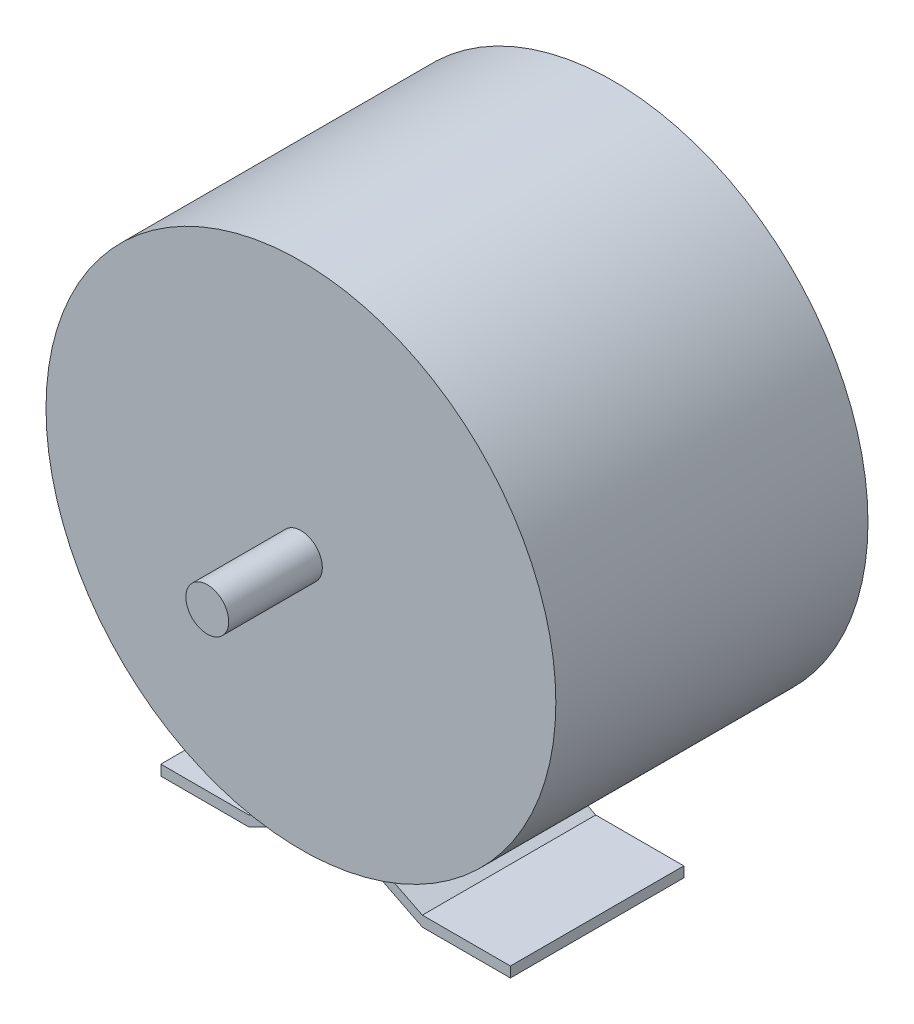
ISO-10303-21;
HEADER;
FILE_DESCRIPTION(('STEP AP214'),'2;1');
FILE_NAME('part.step','',(''),(''),'','','');
FILE_SCHEMA(('AUTOMOTIVE_DESIGN { 1 0 10303 214 1 1 1 1 }'));
ENDSEC;
DATA;
#1=APPLICATION_CONTEXT('core data for automotive mechanical design processes');
#2=APPLICATION_PROTOCOL_DEFINITION('international standard','automotive_design',2000,#1);
#3=PRODUCT_CONTEXT('',#1,'mechanical');
#4=PRODUCT('Part','Part','',(#3));
#5=PRODUCT_RELATED_PRODUCT_CATEGORY('part','',(#4));
#6=PRODUCT_DEFINITION_FORMATION('','',#4);
#7=PRODUCT_DEFINITION_CONTEXT('part definition',#1,'design');
#8=PRODUCT_DEFINITION('design','',#6,#7);
#9=PRODUCT_DEFINITION_SHAPE('','',#8);
#10=(LENGTH_UNIT() NAMED_UNIT(*) SI_UNIT(.MILLI.,.METRE.));
#11=(NAMED_UNIT(*) PLANE_ANGLE_UNIT() SI_UNIT($,.RADIAN.));
#12=(NAMED_UNIT(*) SI_UNIT($,.STERADIAN.) SOLID_ANGLE_UNIT());
#13=UNCERTAINTY_MEASURE_WITH_UNIT(LENGTH_MEASURE(1.E-05),#10,'distance_accuracy_value','');
#14=(GEOMETRIC_REPRESENTATION_CONTEXT(3) GLOBAL_UNCERTAINTY_ASSIGNED_CONTEXT((#13)) GLOBAL_UNIT_ASSIGNED_CONTEXT((#10,
#11,#12)) REPRESENTATION_CONTEXT('',''));
#15=CARTESIAN_POINT('',(0.,0.,0.));
#16=DIRECTION('',(0.,0.,1.));
#17=DIRECTION('',(1.,0.,0.));
#18=AXIS2_PLACEMENT_3D('',#15,#16,#17);
#19=CARTESIAN_POINT('',(0.,0.,90.));
#20=DIRECTION('',(0.,0.,-1.));
#21=DIRECTION('',(-1.,0.,0.));
#22=AXIS2_PLACEMENT_3D('',#19,#20,#21);
#23=CYLINDRICAL_SURFACE('',#22,73.5);
#24=CARTESIAN_POINT('',(0.,0.,90.));
#25=DIRECTION('',(0.,0.,1.));
#26=DIRECTION('',(1.,0.,0.));
#27=AXIS2_PLACEMENT_3D('',#24,#25,#26);
#28=CIRCLE('',#27,73.5);
#29=CARTESIAN_POINT('',(73.5,0.,90.));
#30=VERTEX_POINT('',#29);
#31=EDGE_CURVE('E272',#30,#30,#28,.T.);
#32=ORIENTED_EDGE('',*,*,#31,.F.);
#33=EDGE_LOOP('',(#32));
#34=FACE_BOUND('',#33,.T.);
#35=CARTESIAN_POINT('',(0.,0.,0.));
#36=DIRECTION('',(0.,0.,1.));
#37=DIRECTION('',(1.,0.,0.));
#38=AXIS2_PLACEMENT_3D('',#35,#36,#37);
#39=CIRCLE('',#38,73.5);
#40=CARTESIAN_POINT('',(73.5,0.,0.));
#41=VERTEX_POINT('',#40);
#42=EDGE_CURVE('E268',#41,#41,#39,.T.);
#43=ORIENTED_EDGE('',*,*,#42,.T.);
#44=EDGE_LOOP('',(#43));
#45=FACE_BOUND('',#44,.T.);
#46=DIRECTION('',(0.,0.,-1.));
#47=VECTOR('',#46,1.);
#48=CARTESIAN_POINT('',(6.73139788290122,-73.1911079472232,90.));
#49=LINE('',#48,#47);
#50=CARTESIAN_POINT('',(6.73139788290121,-73.1911079472232,30.));
#51=VERTEX_POINT('',#50);
#52=CARTESIAN_POINT('',(6.73139788290121,-73.1911079472232,80.));
#53=VERTEX_POINT('',#52);
#54=EDGE_CURVE('E286',#51,#53,#49,.F.);
#55=ORIENTED_EDGE('',*,*,#54,.F.);
#56=CARTESIAN_POINT('',(0.,0.,30.));
#57=DIRECTION('',(0.,0.,1.));
#58=DIRECTION('',(1.,0.,0.));
#59=AXIS2_PLACEMENT_3D('',#56,#57,#58);
#60=CIRCLE('',#59,73.5);
#61=CARTESIAN_POINT('',(-6.73139788290121,-73.1911079472232,30.));
#62=VERTEX_POINT('',#61);
#63=EDGE_CURVE('E283',#62,#51,#60,.T.);
#64=ORIENTED_EDGE('',*,*,#63,.F.);
#65=DIRECTION('',(0.,0.,-1.));
#66=VECTOR('',#65,1.);
#67=CARTESIAN_POINT('',(-6.73139788290122,-73.1911079472232,90.));
#68=LINE('',#67,#66);
#69=CARTESIAN_POINT('',(-6.73139788290121,-73.1911079472232,80.));
#70=VERTEX_POINT('',#69);
#71=EDGE_CURVE('E63',#62,#70,#68,.F.);
#72=ORIENTED_EDGE('',*,*,#71,.T.);
#73=CARTESIAN_POINT('',(0.,0.,80.));
#74=DIRECTION('',(0.,0.,1.));
#75=DIRECTION('',(1.,0.,0.));
#76=AXIS2_PLACEMENT_3D('',#73,#74,#75);
#77=CIRCLE('',#76,73.5);
#78=EDGE_CURVE('E71',#70,#53,#77,.T.);
#79=ORIENTED_EDGE('',*,*,#78,.T.);
#80=EDGE_LOOP('',(#55,#64,#72,#79));
#81=FACE_BOUND('',#80,.T.);
#82=ADVANCED_FACE('F46',(#34,#45,#81),#23,.T.);
#83=CARTESIAN_POINT('',(0.,0.,90.));
#84=DIRECTION('',(0.,0.,1.));
#85=DIRECTION('',(1.,0.,0.));
#86=AXIS2_PLACEMENT_3D('',#83,#84,#85);
#87=PLANE('',#86);
#88=CARTESIAN_POINT('',(0.,0.,90.));
#89=DIRECTION('',(0.,0.,1.));
#90=DIRECTION('',(1.,0.,0.));
#91=AXIS2_PLACEMENT_3D('',#88,#89,#90);
#92=CIRCLE('',#91,6.175);
#93=CARTESIAN_POINT('',(6.175,0.,90.));
#94=VERTEX_POINT('',#93);
#95=EDGE_CURVE('E251',#94,#94,#92,.T.);
#96=ORIENTED_EDGE('',*,*,#95,.F.);
#97=EDGE_LOOP('',(#96));
#98=FACE_BOUND('',#97,.T.);
#99=ORIENTED_EDGE('',*,*,#31,.T.);
#100=EDGE_LOOP('',(#99));
#101=FACE_BOUND('',#100,.T.);
#102=ADVANCED_FACE('F310',(#98,#101),#87,.T.);
#103=CARTESIAN_POINT('',(0.,0.,0.));
#104=DIRECTION('',(0.,0.,1.));
#105=DIRECTION('',(1.,0.,0.));
#106=AXIS2_PLACEMENT_3D('',#103,#104,#105);
#107=PLANE('',#106);
#108=ORIENTED_EDGE('',*,*,#42,.F.);
#109=EDGE_LOOP('',(#108));
#110=FACE_BOUND('',#109,.T.);
#111=ADVANCED_FACE('F312',(#110),#107,.F.);
#112=CARTESIAN_POINT('',(0.,0.,117.));
#113=DIRECTION('',(0.,0.,-1.));
#114=DIRECTION('',(-1.,0.,0.));
#115=AXIS2_PLACEMENT_3D('',#112,#113,#114);
#116=CYLINDRICAL_SURFACE('',#115,6.175);
#117=CARTESIAN_POINT('',(0.,0.,117.));
#118=DIRECTION('',(0.,0.,1.));
#119=DIRECTION('',(1.,0.,0.));
#120=AXIS2_PLACEMENT_3D('',#117,#118,#119);
#121=CIRCLE('',#120,6.175);
#122=CARTESIAN_POINT('',(6.175,0.,117.));
#123=VERTEX_POINT('',#122);
#124=EDGE_CURVE('E264',#123,#123,#121,.T.);
#125=ORIENTED_EDGE('',*,*,#124,.F.);
#126=EDGE_LOOP('',(#125));
#127=FACE_BOUND('',#126,.T.);
#128=ORIENTED_EDGE('',*,*,#95,.T.);
#129=EDGE_LOOP('',(#128));
#130=FACE_BOUND('',#129,.T.);
#131=ADVANCED_FACE('F315',(#127,#130),#116,.T.);
#132=CARTESIAN_POINT('',(0.,0.,117.));
#133=DIRECTION('',(0.,0.,1.));
#134=DIRECTION('',(1.,0.,0.));
#135=AXIS2_PLACEMENT_3D('',#132,#133,#134);
#136=PLANE('',#135);
#137=ORIENTED_EDGE('',*,*,#124,.T.);
#138=EDGE_LOOP('',(#137));
#139=FACE_BOUND('',#138,.T.);
#140=ADVANCED_FACE('F322',(#139),#136,.T.);
#141=CARTESIAN_POINT('',(-6.35,-73.,30.));
#142=DIRECTION('',(-0.447980438771671,0.894043358276287,0.));
#143=DIRECTION('',(-0.894043358276287,-0.447980438771671,0.));
#144=AXIS2_PLACEMENT_3D('',#141,#142,#143);
#145=PLANE('',#144);
#146=ORIENTED_EDGE('',*,*,#71,.F.);
#147=DIRECTION('',(-0.894043358276287,-0.447980438771671,0.));
#148=VECTOR('',#147,1.);
#149=CARTESIAN_POINT('',(-6.35,-73.,30.));
#150=LINE('',#149,#148);
#151=CARTESIAN_POINT('',(-25.,-82.3449999999997,30.));
#152=VERTEX_POINT('',#151);
#153=EDGE_CURVE('E220',#62,#152,#150,.T.);
#154=ORIENTED_EDGE('',*,*,#153,.T.);
#155=DIRECTION('',(0.,0.,1.));
#156=VECTOR('',#155,1.);
#157=CARTESIAN_POINT('',(-25.,-82.3449999999997,30.));
#158=LINE('',#157,#156);
#159=CARTESIAN_POINT('',(-25.,-82.3449999999997,80.));
#160=VERTEX_POINT('',#159);
#161=EDGE_CURVE('E252',#152,#160,#158,.T.);
#162=ORIENTED_EDGE('',*,*,#161,.T.);
#163=DIRECTION('',(-0.894043358276287,-0.447980438771671,0.));
#164=VECTOR('',#163,1.);
#165=CARTESIAN_POINT('',(-6.35,-73.,80.));
#166=LINE('',#165,#164);
#167=EDGE_CURVE('E242',#70,#160,#166,.T.);
#168=ORIENTED_EDGE('',*,*,#167,.F.);
#169=EDGE_LOOP('',(#146,#154,#162,#168));
#170=FACE_BOUND('',#169,.T.);
#171=ADVANCED_FACE('F326',(#170),#145,.T.);
#172=CARTESIAN_POINT('',(-50.4,-82.3449999999997,30.));
#173=DIRECTION('',(-1.,0.,0.));
#174=DIRECTION('',(0.,0.,1.));
#175=AXIS2_PLACEMENT_3D('',#172,#173,#174);
#176=PLANE('',#175);
#177=DIRECTION('',(0.,-1.,0.));
#178=VECTOR('',#177,1.);
#179=CARTESIAN_POINT('',(-50.4,-82.3449999999997,80.));
#180=LINE('',#179,#178);
#181=CARTESIAN_POINT('',(-50.4,-82.3449999999997,80.));
#182=VERTEX_POINT('',#181);
#183=CARTESIAN_POINT('',(-50.4,-85.345,80.));
#184=VERTEX_POINT('',#183);
#185=EDGE_CURVE('E193',#182,#184,#180,.T.);
#186=ORIENTED_EDGE('',*,*,#185,.F.);
#187=DIRECTION('',(0.,0.,1.));
#188=VECTOR('',#187,1.);
#189=CARTESIAN_POINT('',(-50.4,-82.3449999999997,30.));
#190=LINE('',#189,#188);
#191=CARTESIAN_POINT('',(-50.4,-82.3449999999997,30.));
#192=VERTEX_POINT('',#191);
#193=EDGE_CURVE('E248',#192,#182,#190,.T.);
#194=ORIENTED_EDGE('',*,*,#193,.F.);
#195=DIRECTION('',(0.,-1.,0.));
#196=VECTOR('',#195,1.);
#197=CARTESIAN_POINT('',(-50.4,-82.3449999999997,30.));
#198=LINE('',#197,#196);
#199=CARTESIAN_POINT('',(-50.4,-85.345,30.));
#200=VERTEX_POINT('',#199);
#201=EDGE_CURVE('E204',#192,#200,#198,.T.);
#202=ORIENTED_EDGE('',*,*,#201,.T.);
#203=DIRECTION('',(0.,0.,1.));
#204=VECTOR('',#203,1.);
#205=CARTESIAN_POINT('',(-50.4,-85.345,30.));
#206=LINE('',#205,#204);
#207=EDGE_CURVE('E227',#200,#184,#206,.T.);
#208=ORIENTED_EDGE('',*,*,#207,.T.);
#209=EDGE_LOOP('',(#186,#194,#202,#208));
#210=FACE_BOUND('',#209,.T.);
#211=ADVANCED_FACE('F328',(#210),#176,.T.);
#212=CARTESIAN_POINT('',(-25.,-82.3449999999997,30.));
#213=DIRECTION('',(0.,1.,0.));
#214=DIRECTION('',(-1.,0.,0.));
#215=AXIS2_PLACEMENT_3D('',#212,#213,#214);
#216=PLANE('',#215);
#217=DIRECTION('',(-1.,0.,0.));
#218=VECTOR('',#217,1.);
#219=CARTESIAN_POINT('',(-25.,-82.3449999999997,80.));
#220=LINE('',#219,#218);
#221=EDGE_CURVE('E209',#160,#182,#220,.T.);
#222=ORIENTED_EDGE('',*,*,#221,.F.);
#223=ORIENTED_EDGE('',*,*,#161,.F.);
#224=DIRECTION('',(-1.,0.,0.));
#225=VECTOR('',#224,1.);
#226=CARTESIAN_POINT('',(-25.,-82.3449999999997,30.));
#227=LINE('',#226,#225);
#228=EDGE_CURVE('E223',#152,#192,#227,.T.);
#229=ORIENTED_EDGE('',*,*,#228,.T.);
#230=ORIENTED_EDGE('',*,*,#193,.T.);
#231=EDGE_LOOP('',(#222,#223,#229,#230));
#232=FACE_BOUND('',#231,.T.);
#233=ADVANCED_FACE('F331',(#232),#216,.T.);
#234=CARTESIAN_POINT('',(-6.35,-76.0000000000002,30.));
#235=DIRECTION('',(0.,-1.,0.));
#236=DIRECTION('',(0.,0.,-1.));
#237=AXIS2_PLACEMENT_3D('',#234,#235,#236);
#238=PLANE('',#237);
#239=DIRECTION('',(1.,0.,0.));
#240=VECTOR('',#239,1.);
#241=CARTESIAN_POINT('',(-6.35,-76.0000000000002,80.));
#242=LINE('',#241,#240);
#243=CARTESIAN_POINT('',(-6.35,-76.0000000000002,80.));
#244=VERTEX_POINT('',#243);
#245=CARTESIAN_POINT('',(6.35,-76.0000000000002,80.));
#246=VERTEX_POINT('',#245);
#247=EDGE_CURVE('E239',#244,#246,#242,.T.);
#248=ORIENTED_EDGE('',*,*,#247,.F.);
#249=DIRECTION('',(0.,0.,1.));
#250=VECTOR('',#249,1.);
#251=CARTESIAN_POINT('',(-6.35,-76.0000000000002,30.));
#252=LINE('',#251,#250);
#253=CARTESIAN_POINT('',(-6.35,-76.0000000000002,30.));
#254=VERTEX_POINT('',#253);
#255=EDGE_CURVE('E256',#254,#244,#252,.T.);
#256=ORIENTED_EDGE('',*,*,#255,.F.);
#257=DIRECTION('',(1.,0.,0.));
#258=VECTOR('',#257,1.);
#259=CARTESIAN_POINT('',(-6.35,-76.0000000000002,30.));
#260=LINE('',#259,#258);
#261=CARTESIAN_POINT('',(6.35,-76.0000000000002,30.));
#262=VERTEX_POINT('',#261);
#263=EDGE_CURVE('E217',#254,#262,#260,.T.);
#264=ORIENTED_EDGE('',*,*,#263,.T.);
#265=DIRECTION('',(0.,0.,1.));
#266=VECTOR('',#265,1.);
#267=CARTESIAN_POINT('',(6.35,-76.0000000000002,30.));
#268=LINE('',#267,#266);
#269=EDGE_CURVE('E198',#262,#246,#268,.T.);
#270=ORIENTED_EDGE('',*,*,#269,.T.);
#271=EDGE_LOOP('',(#248,#256,#264,#270));
#272=FACE_BOUND('',#271,.T.);
#273=ADVANCED_FACE('F340',(#272),#238,.T.);
#274=CARTESIAN_POINT('',(-25.,-85.345,30.));
#275=DIRECTION('',(0.447980438771671,-0.894043358276287,0.));
#276=DIRECTION('',(0.894043358276287,0.447980438771671,0.));
#277=AXIS2_PLACEMENT_3D('',#274,#275,#276);
#278=PLANE('',#277);
#279=DIRECTION('',(0.894043358276287,0.447980438771671,0.));
#280=VECTOR('',#279,1.);
#281=CARTESIAN_POINT('',(-25.,-85.345,80.));
#282=LINE('',#281,#280);
#283=CARTESIAN_POINT('',(-25.,-85.345,80.));
#284=VERTEX_POINT('',#283);
#285=EDGE_CURVE('E235',#284,#244,#282,.T.);
#286=ORIENTED_EDGE('',*,*,#285,.F.);
#287=DIRECTION('',(0.,0.,1.));
#288=VECTOR('',#287,1.);
#289=CARTESIAN_POINT('',(-25.,-85.345,30.));
#290=LINE('',#289,#288);
#291=CARTESIAN_POINT('',(-25.,-85.345,30.));
#292=VERTEX_POINT('',#291);
#293=EDGE_CURVE('E259',#292,#284,#290,.T.);
#294=ORIENTED_EDGE('',*,*,#293,.F.);
#295=DIRECTION('',(0.894043358276287,0.447980438771671,0.));
#296=VECTOR('',#295,1.);
#297=CARTESIAN_POINT('',(-25.,-85.345,30.));
#298=LINE('',#297,#296);
#299=EDGE_CURVE('E213',#292,#254,#298,.T.);
#300=ORIENTED_EDGE('',*,*,#299,.T.);
#301=ORIENTED_EDGE('',*,*,#255,.T.);
#302=EDGE_LOOP('',(#286,#294,#300,#301));
#303=FACE_BOUND('',#302,.T.);
#304=ADVANCED_FACE('F336',(#303),#278,.T.);
#305=CARTESIAN_POINT('',(-50.4,-85.345,30.));
#306=DIRECTION('',(0.,-1.,0.));
#307=DIRECTION('',(1.,0.,0.));
#308=AXIS2_PLACEMENT_3D('',#305,#306,#307);
#309=PLANE('',#308);
#310=DIRECTION('',(1.,0.,0.));
#311=VECTOR('',#310,1.);
#312=CARTESIAN_POINT('',(-50.4,-85.345,80.));
#313=LINE('',#312,#311);
#314=EDGE_CURVE('E231',#184,#284,#313,.T.);
#315=ORIENTED_EDGE('',*,*,#314,.F.);
#316=ORIENTED_EDGE('',*,*,#207,.F.);
#317=DIRECTION('',(1.,0.,0.));
#318=VECTOR('',#317,1.);
#319=CARTESIAN_POINT('',(-50.4,-85.345,30.));
#320=LINE('',#319,#318);
#321=EDGE_CURVE('E208',#200,#292,#320,.T.);
#322=ORIENTED_EDGE('',*,*,#321,.T.);
#323=ORIENTED_EDGE('',*,*,#293,.T.);
#324=EDGE_LOOP('',(#315,#316,#322,#323));
#325=FACE_BOUND('',#324,.T.);
#326=ADVANCED_FACE('F333',(#325),#309,.T.);
#327=CARTESIAN_POINT('',(0.,0.,30.));
#328=DIRECTION('',(0.,0.,1.));
#329=DIRECTION('',(1.,0.,0.));
#330=AXIS2_PLACEMENT_3D('',#327,#328,#329);
#331=PLANE('',#330);
#332=ORIENTED_EDGE('',*,*,#153,.F.);
#333=ORIENTED_EDGE('',*,*,#63,.T.);
#334=DIRECTION('',(0.894043358276287,-0.447980438771671,0.));
#335=VECTOR('',#334,1.);
#336=CARTESIAN_POINT('',(6.35,-73.,30.));
#337=LINE('',#336,#335);
#338=CARTESIAN_POINT('',(25.,-82.3449999999997,30.));
#339=VERTEX_POINT('',#338);
#340=EDGE_CURVE('E144',#51,#339,#337,.T.);
#341=ORIENTED_EDGE('',*,*,#340,.T.);
#342=DIRECTION('',(1.,0.,0.));
#343=VECTOR('',#342,1.);
#344=CARTESIAN_POINT('',(25.,-82.3449999999997,30.));
#345=LINE('',#344,#343);
#346=CARTESIAN_POINT('',(50.4,-82.3449999999997,30.));
#347=VERTEX_POINT('',#346);
#348=EDGE_CURVE('E137',#339,#347,#345,.T.);
#349=ORIENTED_EDGE('',*,*,#348,.T.);
#350=DIRECTION('',(0.,-1.,0.));
#351=VECTOR('',#350,1.);
#352=CARTESIAN_POINT('',(50.4,-82.3449999999997,30.));
#353=LINE('',#352,#351);
#354=CARTESIAN_POINT('',(50.4,-85.345,30.));
#355=VERTEX_POINT('',#354);
#356=EDGE_CURVE('E141',#347,#355,#353,.T.);
#357=ORIENTED_EDGE('',*,*,#356,.T.);
#358=DIRECTION('',(-1.,0.,0.));
#359=VECTOR('',#358,1.);
#360=CARTESIAN_POINT('',(50.4,-85.345,30.));
#361=LINE('',#360,#359);
#362=CARTESIAN_POINT('',(25.,-85.345,30.));
#363=VERTEX_POINT('',#362);
#364=EDGE_CURVE('E160',#355,#363,#361,.T.);
#365=ORIENTED_EDGE('',*,*,#364,.T.);
#366=DIRECTION('',(-0.894043358276287,0.447980438771671,0.));
#367=VECTOR('',#366,1.);
#368=CARTESIAN_POINT('',(25.,-85.345,30.));
#369=LINE('',#368,#367);
#370=EDGE_CURVE('E174',#363,#262,#369,.T.);
#371=ORIENTED_EDGE('',*,*,#370,.T.);
#372=ORIENTED_EDGE('',*,*,#263,.F.);
#373=ORIENTED_EDGE('',*,*,#299,.F.);
#374=ORIENTED_EDGE('',*,*,#321,.F.);
#375=ORIENTED_EDGE('',*,*,#201,.F.);
#376=ORIENTED_EDGE('',*,*,#228,.F.);
#377=EDGE_LOOP('',(#332,#333,#341,#349,#357,#365,#371,#372,#373,#374,#375,#376));
#378=FACE_BOUND('',#377,.T.);
#379=ADVANCED_FACE('F139',(#378),#331,.F.);
#380=CARTESIAN_POINT('',(0.,0.,80.));
#381=DIRECTION('',(0.,0.,1.));
#382=DIRECTION('',(1.,0.,0.));
#383=AXIS2_PLACEMENT_3D('',#380,#381,#382);
#384=PLANE('',#383);
#385=ORIENTED_EDGE('',*,*,#78,.F.);
#386=ORIENTED_EDGE('',*,*,#167,.T.);
#387=ORIENTED_EDGE('',*,*,#221,.T.);
#388=ORIENTED_EDGE('',*,*,#185,.T.);
#389=ORIENTED_EDGE('',*,*,#314,.T.);
#390=ORIENTED_EDGE('',*,*,#285,.T.);
#391=ORIENTED_EDGE('',*,*,#247,.T.);
#392=DIRECTION('',(-0.894043358276287,0.447980438771671,0.));
#393=VECTOR('',#392,1.);
#394=CARTESIAN_POINT('',(25.,-85.345,80.));
#395=LINE('',#394,#393);
#396=CARTESIAN_POINT('',(25.,-85.345,80.));
#397=VERTEX_POINT('',#396);
#398=EDGE_CURVE('E169',#397,#246,#395,.T.);
#399=ORIENTED_EDGE('',*,*,#398,.F.);
#400=DIRECTION('',(-1.,0.,0.));
#401=VECTOR('',#400,1.);
#402=CARTESIAN_POINT('',(50.4,-85.345,80.));
#403=LINE('',#402,#401);
#404=CARTESIAN_POINT('',(50.4,-85.345,80.));
#405=VERTEX_POINT('',#404);
#406=EDGE_CURVE('E166',#405,#397,#403,.T.);
#407=ORIENTED_EDGE('',*,*,#406,.F.);
#408=DIRECTION('',(0.,-1.,0.));
#409=VECTOR('',#408,1.);
#410=CARTESIAN_POINT('',(50.4,-82.3449999999997,80.));
#411=LINE('',#410,#409);
#412=CARTESIAN_POINT('',(50.4,-82.3449999999997,80.));
#413=VERTEX_POINT('',#412);
#414=EDGE_CURVE('E180',#413,#405,#411,.T.);
#415=ORIENTED_EDGE('',*,*,#414,.F.);
#416=DIRECTION('',(1.,0.,0.));
#417=VECTOR('',#416,1.);
#418=CARTESIAN_POINT('',(25.,-82.3449999999997,80.));
#419=LINE('',#418,#417);
#420=CARTESIAN_POINT('',(25.,-82.3449999999997,80.));
#421=VERTEX_POINT('',#420);
#422=EDGE_CURVE('E154',#421,#413,#419,.T.);
#423=ORIENTED_EDGE('',*,*,#422,.F.);
#424=DIRECTION('',(0.894043358276287,-0.447980438771671,0.));
#425=VECTOR('',#424,1.);
#426=CARTESIAN_POINT('',(6.35,-73.,80.));
#427=LINE('',#426,#425);
#428=EDGE_CURVE('E185',#53,#421,#427,.T.);
#429=ORIENTED_EDGE('',*,*,#428,.F.);
#430=EDGE_LOOP('',(#385,#386,#387,#388,#389,#390,#391,#399,#407,#415,#423,#429));
#431=FACE_BOUND('',#430,.T.);
#432=ADVANCED_FACE('F350',(#431),#384,.T.);
#433=CARTESIAN_POINT('',(6.35,-73.,30.));
#434=DIRECTION('',(-0.447980438771671,-0.894043358276287,0.));
#435=DIRECTION('',(0.894043358276287,-0.447980438771671,0.));
#436=AXIS2_PLACEMENT_3D('',#433,#434,#435);
#437=PLANE('',#436);
#438=ORIENTED_EDGE('',*,*,#340,.F.);
#439=ORIENTED_EDGE('',*,*,#54,.T.);
#440=ORIENTED_EDGE('',*,*,#428,.T.);
#441=DIRECTION('',(0.,0.,1.));
#442=VECTOR('',#441,1.);
#443=CARTESIAN_POINT('',(25.,-82.3449999999997,30.));
#444=LINE('',#443,#442);
#445=EDGE_CURVE('E159',#339,#421,#444,.T.);
#446=ORIENTED_EDGE('',*,*,#445,.F.);
#447=EDGE_LOOP('',(#438,#439,#440,#446));
#448=FACE_BOUND('',#447,.T.);
#449=ADVANCED_FACE('F353',(#448),#437,.F.);
#450=CARTESIAN_POINT('',(50.4,-82.3449999999997,30.));
#451=DIRECTION('',(-1.,0.,0.));
#452=DIRECTION('',(0.,0.,1.));
#453=AXIS2_PLACEMENT_3D('',#450,#451,#452);
#454=PLANE('',#453);
#455=ORIENTED_EDGE('',*,*,#414,.T.);
#456=DIRECTION('',(0.,0.,1.));
#457=VECTOR('',#456,1.);
#458=CARTESIAN_POINT('',(50.4,-85.345,30.));
#459=LINE('',#458,#457);
#460=EDGE_CURVE('E164',#355,#405,#459,.T.);
#461=ORIENTED_EDGE('',*,*,#460,.F.);
#462=ORIENTED_EDGE('',*,*,#356,.F.);
#463=DIRECTION('',(0.,0.,1.));
#464=VECTOR('',#463,1.);
#465=CARTESIAN_POINT('',(50.4,-82.3449999999997,30.));
#466=LINE('',#465,#464);
#467=EDGE_CURVE('E151',#347,#413,#466,.T.);
#468=ORIENTED_EDGE('',*,*,#467,.T.);
#469=EDGE_LOOP('',(#455,#461,#462,#468));
#470=FACE_BOUND('',#469,.T.);
#471=ADVANCED_FACE('F162',(#470),#454,.F.);
#472=CARTESIAN_POINT('',(50.4,-85.345,30.));
#473=DIRECTION('',(0.,1.,0.));
#474=DIRECTION('',(-1.,0.,0.));
#475=AXIS2_PLACEMENT_3D('',#472,#473,#474);
#476=PLANE('',#475);
#477=ORIENTED_EDGE('',*,*,#406,.T.);
#478=DIRECTION('',(0.,0.,1.));
#479=VECTOR('',#478,1.);
#480=CARTESIAN_POINT('',(25.,-85.345,30.));
#481=LINE('',#480,#479);
#482=EDGE_CURVE('E194',#363,#397,#481,.T.);
#483=ORIENTED_EDGE('',*,*,#482,.F.);
#484=ORIENTED_EDGE('',*,*,#364,.F.);
#485=ORIENTED_EDGE('',*,*,#460,.T.);
#486=EDGE_LOOP('',(#477,#483,#484,#485));
#487=FACE_BOUND('',#486,.T.);
#488=ADVANCED_FACE('F358',(#487),#476,.F.);
#489=CARTESIAN_POINT('',(25.,-85.345,30.));
#490=DIRECTION('',(0.447980438771671,0.894043358276287,0.));
#491=DIRECTION('',(-0.894043358276287,0.447980438771671,0.));
#492=AXIS2_PLACEMENT_3D('',#489,#490,#491);
#493=PLANE('',#492);
#494=ORIENTED_EDGE('',*,*,#398,.T.);
#495=ORIENTED_EDGE('',*,*,#269,.F.);
#496=ORIENTED_EDGE('',*,*,#370,.F.);
#497=ORIENTED_EDGE('',*,*,#482,.T.);
#498=EDGE_LOOP('',(#494,#495,#496,#497));
#499=FACE_BOUND('',#498,.T.);
#500=ADVANCED_FACE('F360',(#499),#493,.F.);
#501=CARTESIAN_POINT('',(25.,-82.3449999999997,30.));
#502=DIRECTION('',(0.,-1.,0.));
#503=DIRECTION('',(1.,0.,0.));
#504=AXIS2_PLACEMENT_3D('',#501,#502,#503);
#505=PLANE('',#504);
#506=ORIENTED_EDGE('',*,*,#422,.T.);
#507=ORIENTED_EDGE('',*,*,#467,.F.);
#508=ORIENTED_EDGE('',*,*,#348,.F.);
#509=ORIENTED_EDGE('',*,*,#445,.T.);
#510=EDGE_LOOP('',(#506,#507,#508,#509));
#511=FACE_BOUND('',#510,.T.);
#512=ADVANCED_FACE('F152',(#511),#505,.F.);
#513=CLOSED_SHELL('',(#82,#102,#111,#131,#140,#171,#211,#233,#273,#304,#326,#379,#432,#449,#471,
#488,#500,#512));
#514=CARTESIAN_POINT('',(0.,0.,90.));
#515=DIRECTION('',(0.,0.,-1.));
#516=DIRECTION('',(-1.,0.,0.));
#517=AXIS2_PLACEMENT_3D('',#514,#515,#516);
#518=CYLINDRICAL_SURFACE('',#517,65.5);
#519=CARTESIAN_POINT('',(0.,0.,82.));
#520=DIRECTION('',(0.,0.,1.));
#521=DIRECTION('',(1.,0.,0.));
#522=AXIS2_PLACEMENT_3D('',#519,#520,#521);
#523=CIRCLE('',#522,65.5);
#524=CARTESIAN_POINT('',(-65.5,0.,82.));
#525=VERTEX_POINT('',#524);
#526=EDGE_CURVE('E11',#525,#525,#523,.T.);
#527=CARTESIAN_POINT('',(0.,0.,8.00000000000001));
#528=DIRECTION('',(0.,0.,1.));
#529=DIRECTION('',(1.,0.,0.));
#530=AXIS2_PLACEMENT_3D('',#527,#528,#529);
#531=CIRCLE('',#530,65.5);
#532=CARTESIAN_POINT('',(-65.5,0.,7.99999999999999));
#533=VERTEX_POINT('',#532);
#534=EDGE_CURVE('E50',#533,#533,#531,.T.);
#535=CARTESIAN_POINT('',(-65.5,0.,82.));
#536=CARTESIAN_POINT('',(-65.5,0.,81.2291666666666));
#537=CARTESIAN_POINT('',(-65.5,0.,80.4583333333333));
#538=CARTESIAN_POINT('',(-65.5,0.,78.9166666666666));
#539=CARTESIAN_POINT('',(-65.5,0.,78.1458333333333));
#540=CARTESIAN_POINT('',(-65.5,0.,76.6041666666667));
#541=CARTESIAN_POINT('',(-65.5,0.,75.8333333333333));
#542=CARTESIAN_POINT('',(-65.5,0.,74.2916666666666));
#543=CARTESIAN_POINT('',(-65.5,0.,73.5208333333333));
#544=CARTESIAN_POINT('',(-65.5,0.,71.9791666666666));
#545=CARTESIAN_POINT('',(-65.5,0.,71.2083333333333));
#546=CARTESIAN_POINT('',(-65.5,0.,69.6666666666667));
#547=CARTESIAN_POINT('',(-65.5,0.,68.8958333333333));
#548=CARTESIAN_POINT('',(-65.5,0.,67.3541666666667));
#549=CARTESIAN_POINT('',(-65.5,0.,66.5833333333333));
#550=CARTESIAN_POINT('',(-65.5,0.,65.0416666666667));
#551=CARTESIAN_POINT('',(-65.5,0.,64.2708333333333));
#552=CARTESIAN_POINT('',(-65.5,0.,62.7291666666667));
#553=CARTESIAN_POINT('',(-65.5,0.,61.9583333333333));
#554=CARTESIAN_POINT('',(-65.5,0.,60.4166666666667));
#555=CARTESIAN_POINT('',(-65.5,0.,59.6458333333333));
#556=CARTESIAN_POINT('',(-65.5,0.,58.1041666666667));
#557=CARTESIAN_POINT('',(-65.5,0.,57.3333333333333));
#558=CARTESIAN_POINT('',(-65.5,0.,55.7916666666667));
#559=CARTESIAN_POINT('',(-65.5,0.,55.0208333333333));
#560=CARTESIAN_POINT('',(-65.5,0.,53.4791666666667));
#561=CARTESIAN_POINT('',(-65.5,0.,52.7083333333333));
#562=CARTESIAN_POINT('',(-65.5,0.,51.1666666666667));
#563=CARTESIAN_POINT('',(-65.5,0.,50.3958333333333));
#564=CARTESIAN_POINT('',(-65.5,0.,48.8541666666667));
#565=CARTESIAN_POINT('',(-65.5,0.,48.0833333333333));
#566=CARTESIAN_POINT('',(-65.5,0.,46.5416666666667));
#567=CARTESIAN_POINT('',(-65.5,0.,45.7708333333333));
#568=CARTESIAN_POINT('',(-65.5,0.,44.2291666666667));
#569=CARTESIAN_POINT('',(-65.5,0.,43.4583333333333));
#570=CARTESIAN_POINT('',(-65.5,0.,41.9166666666667));
#571=CARTESIAN_POINT('',(-65.5,0.,41.1458333333333));
#572=CARTESIAN_POINT('',(-65.5,0.,39.6041666666667));
#573=CARTESIAN_POINT('',(-65.5,0.,38.8333333333333));
#574=CARTESIAN_POINT('',(-65.5,0.,37.2916666666667));
#575=CARTESIAN_POINT('',(-65.5,0.,36.5208333333333));
#576=CARTESIAN_POINT('',(-65.5,0.,34.9791666666667));
#577=CARTESIAN_POINT('',(-65.5,0.,34.2083333333333));
#578=CARTESIAN_POINT('',(-65.5,0.,32.6666666666667));
#579=CARTESIAN_POINT('',(-65.5,0.,31.8958333333333));
#580=CARTESIAN_POINT('',(-65.5,0.,30.3541666666667));
#581=CARTESIAN_POINT('',(-65.5,0.,29.5833333333333));
#582=CARTESIAN_POINT('',(-65.5,0.,28.0416666666667));
#583=CARTESIAN_POINT('',(-65.5,0.,27.2708333333333));
#584=CARTESIAN_POINT('',(-65.5,0.,25.7291666666667));
#585=CARTESIAN_POINT('',(-65.5,0.,24.9583333333333));
#586=CARTESIAN_POINT('',(-65.5,0.,23.4166666666667));
#587=CARTESIAN_POINT('',(-65.5,0.,22.6458333333333));
#588=CARTESIAN_POINT('',(-65.5,0.,21.1041666666667));
#589=CARTESIAN_POINT('',(-65.5,0.,20.3333333333333));
#590=CARTESIAN_POINT('',(-65.5,0.,18.7916666666667));
#591=CARTESIAN_POINT('',(-65.5,0.,18.0208333333333));
#592=CARTESIAN_POINT('',(-65.5,0.,16.4791666666667));
#593=CARTESIAN_POINT('',(-65.5,0.,15.7083333333333));
#594=CARTESIAN_POINT('',(-65.5,0.,14.1666666666667));
#595=CARTESIAN_POINT('',(-65.5,0.,13.3958333333333));
#596=CARTESIAN_POINT('',(-65.5,0.,11.8541666666667));
#597=CARTESIAN_POINT('',(-65.5,0.,11.0833333333333));
#598=CARTESIAN_POINT('',(-65.5,0.,9.54166666666666));
#599=CARTESIAN_POINT('',(-65.5,0.,8.77083333333333));
#600=CARTESIAN_POINT('',(-65.5,0.,7.99999999999999));
#601=B_SPLINE_CURVE_WITH_KNOTS('',3,(#535,#536,#537,#538,#539,#540,#541,#542,#543,#544,#545,
#546,#547,#548,#549,#550,#551,#552,#553,#554,#555,#556,#557,#558,#559,#560,#561,#562,#563,#564,
#565,#566,#567,#568,#569,#570,#571,#572,#573,#574,#575,#576,#577,#578,#579,#580,#581,#582,#583,
#584,#585,#586,#587,#588,#589,#590,#591,#592,#593,#594,#595,#596,#597,#598,#599,#600),
.UNSPECIFIED.,.F.,.F.,(4,2,2,2,2,2,2,2,2,2,2,2,2,2,2,2,2,2,2,2,2,2,2,2,2,2,2,2,2,2,2,2,4),(0.,
2.3125,4.62499999999999,6.9375,9.24999999999999,11.5625,13.875,16.1875,18.5,20.8125,23.125,
25.4375,27.75,30.0625,32.375,34.6875,37.,39.3125,41.625,43.9375,46.25,48.5625,50.875,53.1875,
55.5,57.8125,60.125,62.4375,64.75,67.0625,69.375,71.6875,74.),.UNSPECIFIED.);
#602=EDGE_CURVE('BSEAM296',#525,#533,#601,.T.);
#603=ORIENTED_EDGE('',*,*,#526,.T.);
#604=ORIENTED_EDGE('',*,*,#534,.F.);
#605=ORIENTED_EDGE('',*,*,#602,.T.);
#606=ORIENTED_EDGE('',*,*,#602,.F.);
#607=EDGE_LOOP('',(#603,#605,#604,#606));
#608=FACE_BOUND('',#607,.T.);
#609=ADVANCED_FACE('F296',(#608),#518,.F.);
#610=CARTESIAN_POINT('',(0.,0.,82.));
#611=DIRECTION('',(0.,0.,1.));
#612=DIRECTION('',(1.,0.,0.));
#613=AXIS2_PLACEMENT_3D('',#610,#611,#612);
#614=PLANE('',#613);
#615=ORIENTED_EDGE('',*,*,#526,.F.);
#616=EDGE_LOOP('',(#615));
#617=FACE_BOUND('',#616,.T.);
#618=ADVANCED_FACE('F298',(#617),#614,.F.);
#619=CARTESIAN_POINT('',(0.,0.,8.));
#620=DIRECTION('',(0.,0.,1.));
#621=DIRECTION('',(1.,0.,0.));
#622=AXIS2_PLACEMENT_3D('',#619,#620,#621);
#623=PLANE('',#622);
#624=ORIENTED_EDGE('',*,*,#534,.T.);
#625=EDGE_LOOP('',(#624));
#626=FACE_BOUND('',#625,.T.);
#627=ADVANCED_FACE('F48',(#626),#623,.T.);
#628=CLOSED_SHELL('',(#609,#618,#627));
#629=ORIENTED_CLOSED_SHELL('',*,#628,.T.);
#630=BREP_WITH_VOIDS('B2',#513,(#629));
#631=ADVANCED_BREP_SHAPE_REPRESENTATION('',(#18,#630),#14);
#632=SHAPE_DEFINITION_REPRESENTATION(#9,#631);
ENDSEC;
END-ISO-10303-21;
